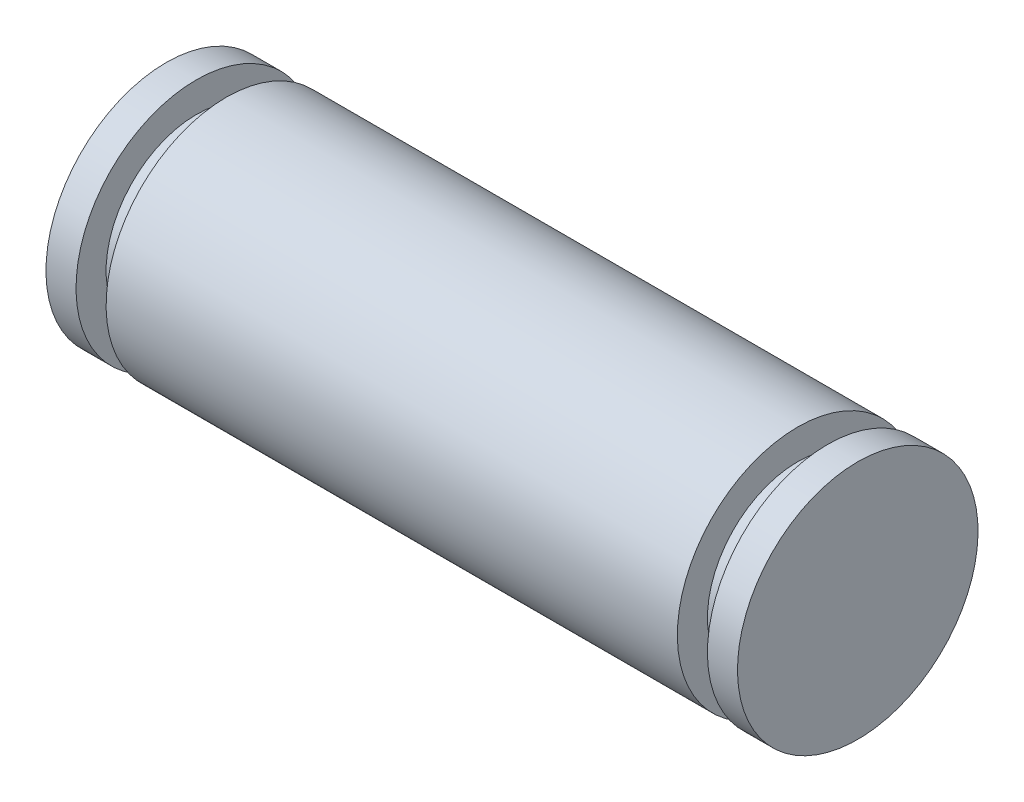
ISO-10303-21;
HEADER;
FILE_DESCRIPTION(('STEP AP214'),'2;1');
FILE_NAME('part.step','',(''),(''),'','','');
FILE_SCHEMA(('AUTOMOTIVE_DESIGN { 1 0 10303 214 1 1 1 1 }'));
ENDSEC;
DATA;
#1=APPLICATION_CONTEXT('core data for automotive mechanical design processes');
#2=APPLICATION_PROTOCOL_DEFINITION('international standard','automotive_design',2000,#1);
#3=PRODUCT_CONTEXT('',#1,'mechanical');
#4=PRODUCT('Part','Part','',(#3));
#5=PRODUCT_RELATED_PRODUCT_CATEGORY('part','',(#4));
#6=PRODUCT_DEFINITION_FORMATION('','',#4);
#7=PRODUCT_DEFINITION_CONTEXT('part definition',#1,'design');
#8=PRODUCT_DEFINITION('design','',#6,#7);
#9=PRODUCT_DEFINITION_SHAPE('','',#8);
#10=(LENGTH_UNIT() NAMED_UNIT(*) SI_UNIT(.MILLI.,.METRE.));
#11=(NAMED_UNIT(*) PLANE_ANGLE_UNIT() SI_UNIT($,.RADIAN.));
#12=(NAMED_UNIT(*) SI_UNIT($,.STERADIAN.) SOLID_ANGLE_UNIT());
#13=UNCERTAINTY_MEASURE_WITH_UNIT(LENGTH_MEASURE(1.E-05),#10,'distance_accuracy_value','');
#14=(GEOMETRIC_REPRESENTATION_CONTEXT(3) GLOBAL_UNCERTAINTY_ASSIGNED_CONTEXT((#13)) GLOBAL_UNIT_ASSIGNED_CONTEXT((#10,
#11,#12)) REPRESENTATION_CONTEXT('',''));
#15=CARTESIAN_POINT('',(0.,0.,0.));
#16=DIRECTION('',(0.,0.,1.));
#17=DIRECTION('',(1.,0.,0.));
#18=AXIS2_PLACEMENT_3D('',#15,#16,#17);
#19=CARTESIAN_POINT('',(-11.5,0.,0.));
#20=DIRECTION('',(-1.,0.,0.));
#21=DIRECTION('',(0.,-1.,0.));
#22=AXIS2_PLACEMENT_3D('',#19,#20,#21);
#23=PLANE('',#22);
#24=CARTESIAN_POINT('',(-11.5,0.,0.));
#25=DIRECTION('',(1.,0.,0.));
#26=DIRECTION('',(0.,1.,0.));
#27=AXIS2_PLACEMENT_3D('',#24,#25,#26);
#28=CIRCLE('',#27,4.);
#29=CARTESIAN_POINT('',(-11.5,4.,0.));
#30=VERTEX_POINT('',#29);
#31=EDGE_CURVE('E10',#30,#30,#28,.T.);
#32=ORIENTED_EDGE('',*,*,#31,.F.);
#33=EDGE_LOOP('',(#32));
#34=FACE_BOUND('',#33,.T.);
#35=ADVANCED_FACE('F30',(#34),#23,.T.);
#36=CARTESIAN_POINT('',(11.5,0.,0.));
#37=DIRECTION('',(1.,0.,0.));
#38=DIRECTION('',(0.,1.,0.));
#39=AXIS2_PLACEMENT_3D('',#36,#37,#38);
#40=CYLINDRICAL_SURFACE('',#39,4.);
#41=ORIENTED_EDGE('',*,*,#31,.T.);
#42=EDGE_LOOP('',(#41));
#43=FACE_BOUND('',#42,.T.);
#44=CARTESIAN_POINT('',(-10.5,0.,0.));
#45=DIRECTION('',(1.,0.,0.));
#46=DIRECTION('',(0.,1.,0.));
#47=AXIS2_PLACEMENT_3D('',#44,#45,#46);
#48=CIRCLE('',#47,4.);
#49=CARTESIAN_POINT('',(-10.5,4.,0.));
#50=VERTEX_POINT('',#49);
#51=EDGE_CURVE('E36',#50,#50,#48,.T.);
#52=ORIENTED_EDGE('',*,*,#51,.F.);
#53=EDGE_LOOP('',(#52));
#54=FACE_BOUND('',#53,.T.);
#55=ADVANCED_FACE('F84',(#43,#54),#40,.T.);
#56=CARTESIAN_POINT('',(-10.5,4.,0.));
#57=DIRECTION('',(1.,0.,0.));
#58=DIRECTION('',(0.,1.,0.));
#59=AXIS2_PLACEMENT_3D('',#56,#57,#58);
#60=PLANE('',#59);
#61=ORIENTED_EDGE('',*,*,#51,.T.);
#62=EDGE_LOOP('',(#61));
#63=FACE_BOUND('',#62,.T.);
#64=CARTESIAN_POINT('',(-10.5,0.,0.));
#65=DIRECTION('',(1.,0.,0.));
#66=DIRECTION('',(0.,1.,0.));
#67=AXIS2_PLACEMENT_3D('',#64,#65,#66);
#68=CIRCLE('',#67,3.);
#69=CARTESIAN_POINT('',(-10.5,3.,0.));
#70=VERTEX_POINT('',#69);
#71=EDGE_CURVE('E40',#70,#70,#68,.T.);
#72=ORIENTED_EDGE('',*,*,#71,.F.);
#73=EDGE_LOOP('',(#72));
#74=FACE_BOUND('',#73,.T.);
#75=ADVANCED_FACE('F89',(#63,#74),#60,.T.);
#76=CARTESIAN_POINT('',(11.5,0.,0.));
#77=DIRECTION('',(1.,0.,0.));
#78=DIRECTION('',(0.,1.,0.));
#79=AXIS2_PLACEMENT_3D('',#76,#77,#78);
#80=CYLINDRICAL_SURFACE('',#79,3.);
#81=ORIENTED_EDGE('',*,*,#71,.T.);
#82=EDGE_LOOP('',(#81));
#83=FACE_BOUND('',#82,.T.);
#84=CARTESIAN_POINT('',(-9.5,0.,0.));
#85=DIRECTION('',(1.,0.,0.));
#86=DIRECTION('',(0.,1.,0.));
#87=AXIS2_PLACEMENT_3D('',#84,#85,#86);
#88=CIRCLE('',#87,3.);
#89=CARTESIAN_POINT('',(-9.5,3.,0.));
#90=VERTEX_POINT('',#89);
#91=EDGE_CURVE('E44',#90,#90,#88,.T.);
#92=ORIENTED_EDGE('',*,*,#91,.F.);
#93=EDGE_LOOP('',(#92));
#94=FACE_BOUND('',#93,.T.);
#95=ADVANCED_FACE('F93',(#83,#94),#80,.T.);
#96=CARTESIAN_POINT('',(-9.5,3.,0.));
#97=DIRECTION('',(-1.,0.,0.));
#98=DIRECTION('',(0.,-1.,0.));
#99=AXIS2_PLACEMENT_3D('',#96,#97,#98);
#100=PLANE('',#99);
#101=ORIENTED_EDGE('',*,*,#91,.T.);
#102=EDGE_LOOP('',(#101));
#103=FACE_BOUND('',#102,.T.);
#104=CARTESIAN_POINT('',(-9.5,0.,0.));
#105=DIRECTION('',(1.,0.,0.));
#106=DIRECTION('',(0.,1.,0.));
#107=AXIS2_PLACEMENT_3D('',#104,#105,#106);
#108=CIRCLE('',#107,4.);
#109=CARTESIAN_POINT('',(-9.5,4.,0.));
#110=VERTEX_POINT('',#109);
#111=EDGE_CURVE('E49',#110,#110,#108,.T.);
#112=ORIENTED_EDGE('',*,*,#111,.F.);
#113=EDGE_LOOP('',(#112));
#114=FACE_BOUND('',#113,.T.);
#115=ADVANCED_FACE('F99',(#103,#114),#100,.T.);
#116=CARTESIAN_POINT('',(11.5,0.,0.));
#117=DIRECTION('',(1.,0.,0.));
#118=DIRECTION('',(0.,1.,0.));
#119=AXIS2_PLACEMENT_3D('',#116,#117,#118);
#120=CYLINDRICAL_SURFACE('',#119,4.);
#121=ORIENTED_EDGE('',*,*,#111,.T.);
#122=EDGE_LOOP('',(#121));
#123=FACE_BOUND('',#122,.T.);
#124=CARTESIAN_POINT('',(9.5,0.,0.));
#125=DIRECTION('',(1.,0.,0.));
#126=DIRECTION('',(0.,1.,0.));
#127=AXIS2_PLACEMENT_3D('',#124,#125,#126);
#128=CIRCLE('',#127,4.);
#129=CARTESIAN_POINT('',(9.5,4.,0.));
#130=VERTEX_POINT('',#129);
#131=EDGE_CURVE('E52',#130,#130,#128,.T.);
#132=ORIENTED_EDGE('',*,*,#131,.F.);
#133=EDGE_LOOP('',(#132));
#134=FACE_BOUND('',#133,.T.);
#135=ADVANCED_FACE('F103',(#123,#134),#120,.T.);
#136=CARTESIAN_POINT('',(9.5,4.,0.));
#137=DIRECTION('',(1.,0.,0.));
#138=DIRECTION('',(0.,1.,0.));
#139=AXIS2_PLACEMENT_3D('',#136,#137,#138);
#140=PLANE('',#139);
#141=ORIENTED_EDGE('',*,*,#131,.T.);
#142=EDGE_LOOP('',(#141));
#143=FACE_BOUND('',#142,.T.);
#144=CARTESIAN_POINT('',(9.5,0.,0.));
#145=DIRECTION('',(1.,0.,0.));
#146=DIRECTION('',(0.,1.,0.));
#147=AXIS2_PLACEMENT_3D('',#144,#145,#146);
#148=CIRCLE('',#147,3.);
#149=CARTESIAN_POINT('',(9.5,3.,0.));
#150=VERTEX_POINT('',#149);
#151=EDGE_CURVE('E55',#150,#150,#148,.T.);
#152=ORIENTED_EDGE('',*,*,#151,.F.);
#153=EDGE_LOOP('',(#152));
#154=FACE_BOUND('',#153,.T.);
#155=ADVANCED_FACE('F107',(#143,#154),#140,.T.);
#156=CARTESIAN_POINT('',(11.5,0.,0.));
#157=DIRECTION('',(1.,0.,0.));
#158=DIRECTION('',(0.,1.,0.));
#159=AXIS2_PLACEMENT_3D('',#156,#157,#158);
#160=CYLINDRICAL_SURFACE('',#159,3.);
#161=ORIENTED_EDGE('',*,*,#151,.T.);
#162=EDGE_LOOP('',(#161));
#163=FACE_BOUND('',#162,.T.);
#164=CARTESIAN_POINT('',(10.5,0.,0.));
#165=DIRECTION('',(1.,0.,0.));
#166=DIRECTION('',(0.,1.,0.));
#167=AXIS2_PLACEMENT_3D('',#164,#165,#166);
#168=CIRCLE('',#167,3.);
#169=CARTESIAN_POINT('',(10.5,3.,0.));
#170=VERTEX_POINT('',#169);
#171=EDGE_CURVE('E58',#170,#170,#168,.T.);
#172=ORIENTED_EDGE('',*,*,#171,.F.);
#173=EDGE_LOOP('',(#172));
#174=FACE_BOUND('',#173,.T.);
#175=ADVANCED_FACE('F80',(#163,#174),#160,.T.);
#176=CARTESIAN_POINT('',(10.5,3.,0.));
#177=DIRECTION('',(-1.,0.,0.));
#178=DIRECTION('',(0.,-1.,0.));
#179=AXIS2_PLACEMENT_3D('',#176,#177,#178);
#180=PLANE('',#179);
#181=ORIENTED_EDGE('',*,*,#171,.T.);
#182=EDGE_LOOP('',(#181));
#183=FACE_BOUND('',#182,.T.);
#184=CARTESIAN_POINT('',(10.5,0.,0.));
#185=DIRECTION('',(1.,0.,0.));
#186=DIRECTION('',(0.,1.,0.));
#187=AXIS2_PLACEMENT_3D('',#184,#185,#186);
#188=CIRCLE('',#187,4.);
#189=CARTESIAN_POINT('',(10.5,4.,0.));
#190=VERTEX_POINT('',#189);
#191=EDGE_CURVE('E61',#190,#190,#188,.T.);
#192=ORIENTED_EDGE('',*,*,#191,.F.);
#193=EDGE_LOOP('',(#192));
#194=FACE_BOUND('',#193,.T.);
#195=ADVANCED_FACE('F72',(#183,#194),#180,.T.);
#196=CARTESIAN_POINT('',(11.5,0.,0.));
#197=DIRECTION('',(1.,0.,0.));
#198=DIRECTION('',(0.,1.,0.));
#199=AXIS2_PLACEMENT_3D('',#196,#197,#198);
#200=CYLINDRICAL_SURFACE('',#199,4.);
#201=ORIENTED_EDGE('',*,*,#191,.T.);
#202=EDGE_LOOP('',(#201));
#203=FACE_BOUND('',#202,.T.);
#204=CARTESIAN_POINT('',(11.5,0.,0.));
#205=DIRECTION('',(1.,0.,0.));
#206=DIRECTION('',(0.,1.,0.));
#207=AXIS2_PLACEMENT_3D('',#204,#205,#206);
#208=CIRCLE('',#207,4.);
#209=CARTESIAN_POINT('',(11.5,4.,0.));
#210=VERTEX_POINT('',#209);
#211=EDGE_CURVE('E64',#210,#210,#208,.T.);
#212=ORIENTED_EDGE('',*,*,#211,.F.);
#213=EDGE_LOOP('',(#212));
#214=FACE_BOUND('',#213,.T.);
#215=ADVANCED_FACE('F70',(#203,#214),#200,.T.);
#216=CARTESIAN_POINT('',(11.5,4.,0.));
#217=DIRECTION('',(1.,0.,0.));
#218=DIRECTION('',(0.,1.,0.));
#219=AXIS2_PLACEMENT_3D('',#216,#217,#218);
#220=PLANE('',#219);
#221=ORIENTED_EDGE('',*,*,#211,.T.);
#222=EDGE_LOOP('',(#221));
#223=FACE_BOUND('',#222,.T.);
#224=ADVANCED_FACE('F68',(#223),#220,.T.);
#225=CLOSED_SHELL('',(#35,#55,#75,#95,#115,#135,#155,#175,#195,#215,#224));
#226=MANIFOLD_SOLID_BREP('B2',#225);
#227=ADVANCED_BREP_SHAPE_REPRESENTATION('',(#18,#226),#14);
#228=SHAPE_DEFINITION_REPRESENTATION(#9,#227);
ENDSEC;
END-ISO-10303-21;
